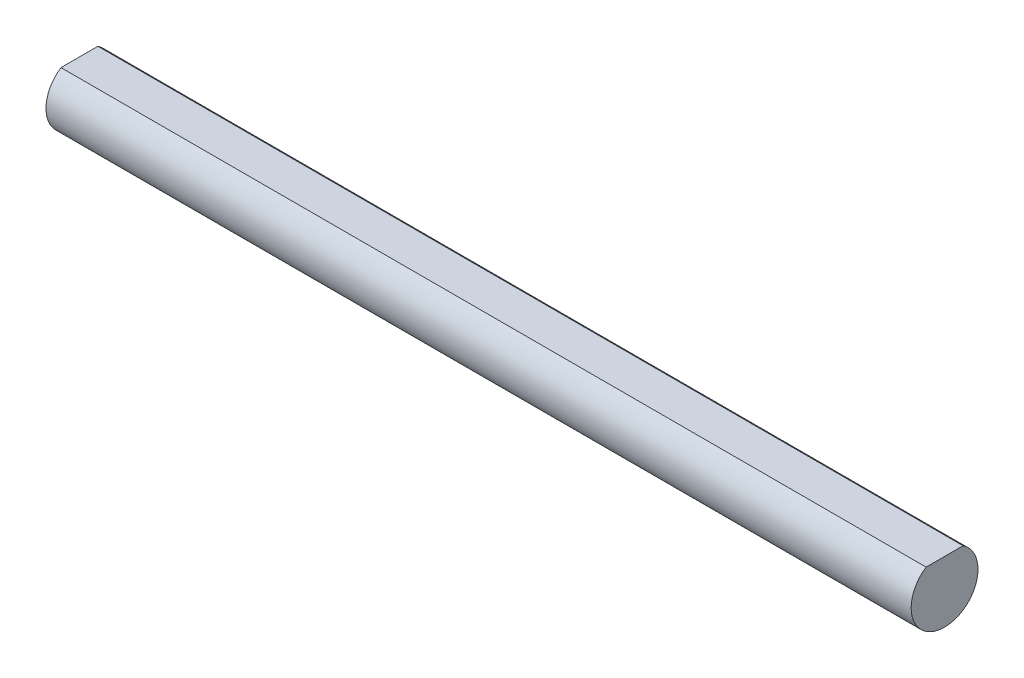
ISO-10303-21;
HEADER;
FILE_DESCRIPTION(('STEP AP214'),'2;1');
FILE_NAME('part.step','',(''),(''),'','','');
FILE_SCHEMA(('AUTOMOTIVE_DESIGN { 1 0 10303 214 1 1 1 1 }'));
ENDSEC;
DATA;
#1=APPLICATION_CONTEXT('core data for automotive mechanical design processes');
#2=APPLICATION_PROTOCOL_DEFINITION('international standard','automotive_design',2000,#1);
#3=PRODUCT_CONTEXT('',#1,'mechanical');
#4=PRODUCT('Part','Part','',(#3));
#5=PRODUCT_RELATED_PRODUCT_CATEGORY('part','',(#4));
#6=PRODUCT_DEFINITION_FORMATION('','',#4);
#7=PRODUCT_DEFINITION_CONTEXT('part definition',#1,'design');
#8=PRODUCT_DEFINITION('design','',#6,#7);
#9=PRODUCT_DEFINITION_SHAPE('','',#8);
#10=(LENGTH_UNIT() NAMED_UNIT(*) SI_UNIT(.MILLI.,.METRE.));
#11=(NAMED_UNIT(*) PLANE_ANGLE_UNIT() SI_UNIT($,.RADIAN.));
#12=(NAMED_UNIT(*) SI_UNIT($,.STERADIAN.) SOLID_ANGLE_UNIT());
#13=UNCERTAINTY_MEASURE_WITH_UNIT(LENGTH_MEASURE(1.E-05),#10,'distance_accuracy_value','');
#14=(GEOMETRIC_REPRESENTATION_CONTEXT(3) GLOBAL_UNCERTAINTY_ASSIGNED_CONTEXT((#13)) GLOBAL_UNIT_ASSIGNED_CONTEXT((#10,
#11,#12)) REPRESENTATION_CONTEXT('',''));
#15=CARTESIAN_POINT('',(0.,0.,0.));
#16=DIRECTION('',(0.,0.,1.));
#17=DIRECTION('',(1.,0.,0.));
#18=AXIS2_PLACEMENT_3D('',#15,#16,#17);
#19=CARTESIAN_POINT('',(14.5145762920099,0.,0.));
#20=DIRECTION('',(1.,0.,0.));
#21=DIRECTION('',(0.,1.,0.));
#22=AXIS2_PLACEMENT_3D('',#19,#20,#21);
#23=PLANE('',#22);
#24=CARTESIAN_POINT('',(14.51457629201,120.,0.));
#25=DIRECTION('',(-1.,0.,0.));
#26=DIRECTION('',(0.,-1.,0.));
#27=AXIS2_PLACEMENT_3D('',#24,#25,#26);
#28=CIRCLE('',#27,3.);
#29=CARTESIAN_POINT('',(14.51457629201,122.5,-1.6583123951777));
#30=VERTEX_POINT('',#29);
#31=CARTESIAN_POINT('',(14.51457629201,122.5,1.6583123951777));
#32=VERTEX_POINT('',#31);
#33=EDGE_CURVE('E78',#30,#32,#28,.T.);
#34=ORIENTED_EDGE('',*,*,#33,.T.);
#35=DIRECTION('',(0.,0.,1.));
#36=VECTOR('',#35,1.);
#37=CARTESIAN_POINT('',(14.51457629201,122.5,0.));
#38=LINE('',#37,#36);
#39=EDGE_CURVE('E69',#30,#32,#38,.T.);
#40=ORIENTED_EDGE('',*,*,#39,.F.);
#41=EDGE_LOOP('',(#34,#40));
#42=FACE_BOUND('',#41,.T.);
#43=ADVANCED_FACE('F45',(#42),#23,.F.);
#44=CARTESIAN_POINT('',(92.15,0.,0.));
#45=DIRECTION('',(1.,0.,0.));
#46=DIRECTION('',(0.,1.,0.));
#47=AXIS2_PLACEMENT_3D('',#44,#45,#46);
#48=PLANE('',#47);
#49=DIRECTION('',(0.,0.,-1.));
#50=VECTOR('',#49,1.);
#51=CARTESIAN_POINT('',(92.1500000000001,122.5,0.));
#52=LINE('',#51,#50);
#53=CARTESIAN_POINT('',(92.1500000000001,122.5,1.6583123951777));
#54=VERTEX_POINT('',#53);
#55=CARTESIAN_POINT('',(92.1500000000001,122.5,-1.6583123951777));
#56=VERTEX_POINT('',#55);
#57=EDGE_CURVE('E59',#54,#56,#52,.T.);
#58=ORIENTED_EDGE('',*,*,#57,.F.);
#59=CARTESIAN_POINT('',(92.1500000000001,120.,0.));
#60=DIRECTION('',(-1.,0.,0.));
#61=DIRECTION('',(0.,-1.,0.));
#62=AXIS2_PLACEMENT_3D('',#59,#60,#61);
#63=CIRCLE('',#62,3.);
#64=EDGE_CURVE('E75',#56,#54,#63,.T.);
#65=ORIENTED_EDGE('',*,*,#64,.F.);
#66=EDGE_LOOP('',(#58,#65));
#67=FACE_BOUND('',#66,.T.);
#68=ADVANCED_FACE('F89',(#67),#48,.T.);
#69=CARTESIAN_POINT('',(14.51457629201,120.,0.));
#70=DIRECTION('',(-1.,0.,0.));
#71=DIRECTION('',(0.,-1.,0.));
#72=AXIS2_PLACEMENT_3D('',#69,#70,#71);
#73=CYLINDRICAL_SURFACE('',#72,3.);
#74=DIRECTION('',(-1.,0.,0.));
#75=VECTOR('',#74,1.);
#76=CARTESIAN_POINT('',(14.51457629201,122.5,1.6583123951777));
#77=LINE('',#76,#75);
#78=EDGE_CURVE('E11',#32,#54,#77,.F.);
#79=ORIENTED_EDGE('',*,*,#78,.F.);
#80=ORIENTED_EDGE('',*,*,#33,.F.);
#81=DIRECTION('',(-1.,0.,0.));
#82=VECTOR('',#81,1.);
#83=CARTESIAN_POINT('',(14.51457629201,122.5,-1.6583123951777));
#84=LINE('',#83,#82);
#85=EDGE_CURVE('E53',#56,#30,#84,.T.);
#86=ORIENTED_EDGE('',*,*,#85,.F.);
#87=ORIENTED_EDGE('',*,*,#64,.T.);
#88=EDGE_LOOP('',(#79,#80,#86,#87));
#89=FACE_BOUND('',#88,.T.);
#90=ADVANCED_FACE('F81',(#89),#73,.T.);
#91=CARTESIAN_POINT('',(93.51457629201,122.5,0.));
#92=DIRECTION('',(0.,-1.,0.));
#93=DIRECTION('',(1.,0.,0.));
#94=AXIS2_PLACEMENT_3D('',#91,#92,#93);
#95=PLANE('',#94);
#96=ORIENTED_EDGE('',*,*,#57,.T.);
#97=ORIENTED_EDGE('',*,*,#85,.T.);
#98=ORIENTED_EDGE('',*,*,#39,.T.);
#99=ORIENTED_EDGE('',*,*,#78,.T.);
#100=EDGE_LOOP('',(#96,#97,#98,#99));
#101=FACE_BOUND('',#100,.T.);
#102=ADVANCED_FACE('F68',(#101),#95,.F.);
#103=CLOSED_SHELL('',(#43,#68,#90,#102));
#104=MANIFOLD_SOLID_BREP('B2',#103);
#105=ADVANCED_BREP_SHAPE_REPRESENTATION('',(#18,#104),#14);
#106=SHAPE_DEFINITION_REPRESENTATION(#9,#105);
ENDSEC;
END-ISO-10303-21;
